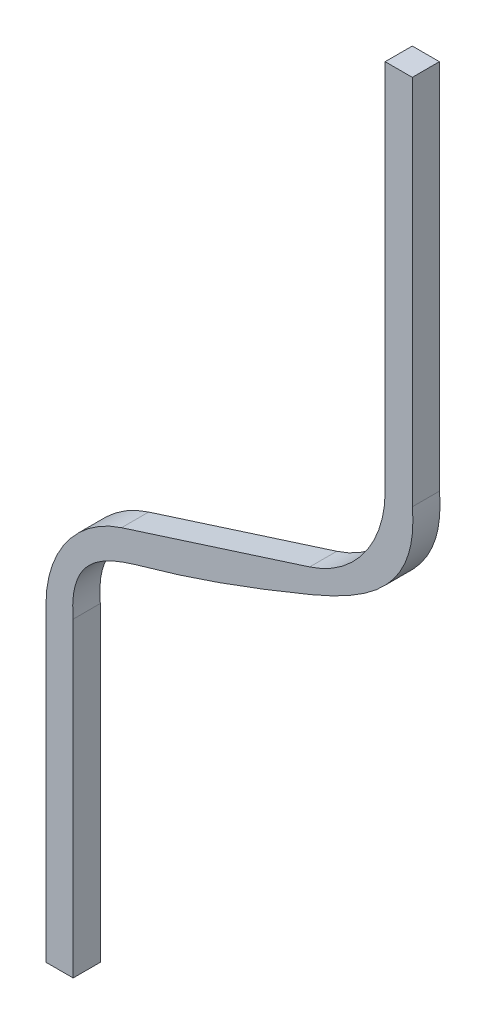
ISO-10303-21;
HEADER;
FILE_DESCRIPTION(('STEP AP214'),'2;1');
FILE_NAME('part.step','',(''),(''),'','','');
FILE_SCHEMA(('AUTOMOTIVE_DESIGN { 1 0 10303 214 1 1 1 1 }'));
ENDSEC;
DATA;
#1=APPLICATION_CONTEXT('core data for automotive mechanical design processes');
#2=APPLICATION_PROTOCOL_DEFINITION('international standard','automotive_design',2000,#1);
#3=PRODUCT_CONTEXT('',#1,'mechanical');
#4=PRODUCT('Part','Part','',(#3));
#5=PRODUCT_RELATED_PRODUCT_CATEGORY('part','',(#4));
#6=PRODUCT_DEFINITION_FORMATION('','',#4);
#7=PRODUCT_DEFINITION_CONTEXT('part definition',#1,'design');
#8=PRODUCT_DEFINITION('design','',#6,#7);
#9=PRODUCT_DEFINITION_SHAPE('','',#8);
#10=(LENGTH_UNIT() NAMED_UNIT(*) SI_UNIT(.MILLI.,.METRE.));
#11=(NAMED_UNIT(*) PLANE_ANGLE_UNIT() SI_UNIT($,.RADIAN.));
#12=(NAMED_UNIT(*) SI_UNIT($,.STERADIAN.) SOLID_ANGLE_UNIT());
#13=UNCERTAINTY_MEASURE_WITH_UNIT(LENGTH_MEASURE(1.E-05),#10,'distance_accuracy_value','');
#14=(GEOMETRIC_REPRESENTATION_CONTEXT(3) GLOBAL_UNCERTAINTY_ASSIGNED_CONTEXT((#13)) GLOBAL_UNIT_ASSIGNED_CONTEXT((#10,
#11,#12)) REPRESENTATION_CONTEXT('',''));
#15=CARTESIAN_POINT('',(0.,0.,0.));
#16=DIRECTION('',(0.,0.,1.));
#17=DIRECTION('',(1.,0.,0.));
#18=AXIS2_PLACEMENT_3D('',#15,#16,#17);
#19=CARTESIAN_POINT('',(0.,0.,0.2));
#20=DIRECTION('',(0.,1.,0.));
#21=DIRECTION('',(0.,0.,1.));
#22=AXIS2_PLACEMENT_3D('',#19,#20,#21);
#23=PLANE('',#22);
#24=DIRECTION('',(1.,0.,0.));
#25=VECTOR('',#24,1.);
#26=CARTESIAN_POINT('',(0.,0.,0.));
#27=LINE('',#26,#25);
#28=CARTESIAN_POINT('',(0.,0.,0.));
#29=VERTEX_POINT('',#28);
#30=CARTESIAN_POINT('',(0.2,0.,0.));
#31=VERTEX_POINT('',#30);
#32=EDGE_CURVE('E142',#29,#31,#27,.T.);
#33=ORIENTED_EDGE('',*,*,#32,.T.);
#34=DIRECTION('',(0.,0.,-1.));
#35=VECTOR('',#34,1.);
#36=CARTESIAN_POINT('',(0.2,0.,0.2));
#37=LINE('',#36,#35);
#38=CARTESIAN_POINT('',(0.2,0.,0.2));
#39=VERTEX_POINT('',#38);
#40=EDGE_CURVE('E11',#39,#31,#37,.T.);
#41=ORIENTED_EDGE('',*,*,#40,.F.);
#42=DIRECTION('',(1.,0.,0.));
#43=VECTOR('',#42,1.);
#44=CARTESIAN_POINT('',(0.,0.,0.2));
#45=LINE('',#44,#43);
#46=CARTESIAN_POINT('',(0.,0.,0.2));
#47=VERTEX_POINT('',#46);
#48=EDGE_CURVE('E165',#47,#39,#45,.T.);
#49=ORIENTED_EDGE('',*,*,#48,.F.);
#50=DIRECTION('',(0.,0.,-1.));
#51=VECTOR('',#50,1.);
#52=CARTESIAN_POINT('',(0.,0.,0.2));
#53=LINE('',#52,#51);
#54=EDGE_CURVE('E138',#47,#29,#53,.T.);
#55=ORIENTED_EDGE('',*,*,#54,.T.);
#56=EDGE_LOOP('',(#33,#41,#49,#55));
#57=FACE_BOUND('',#56,.T.);
#58=ADVANCED_FACE('F34',(#57),#23,.F.);
#59=CARTESIAN_POINT('',(0.2,0.,0.2));
#60=DIRECTION('',(-1.,0.,0.));
#61=DIRECTION('',(0.,0.,1.));
#62=AXIS2_PLACEMENT_3D('',#59,#60,#61);
#63=PLANE('',#62);
#64=DIRECTION('',(0.,1.,0.));
#65=VECTOR('',#64,1.);
#66=CARTESIAN_POINT('',(0.2,0.,0.));
#67=LINE('',#66,#65);
#68=CARTESIAN_POINT('',(0.2,2.29100644298195,0.));
#69=VERTEX_POINT('',#68);
#70=EDGE_CURVE('E145',#31,#69,#67,.T.);
#71=ORIENTED_EDGE('',*,*,#70,.T.);
#72=DIRECTION('',(0.,0.,-1.));
#73=VECTOR('',#72,1.);
#74=CARTESIAN_POINT('',(0.2,2.29100644298195,0.2));
#75=LINE('',#74,#73);
#76=CARTESIAN_POINT('',(0.2,2.29100644298195,0.2));
#77=VERTEX_POINT('',#76);
#78=EDGE_CURVE('E42',#77,#69,#75,.T.);
#79=ORIENTED_EDGE('',*,*,#78,.F.);
#80=DIRECTION('',(0.,1.,0.));
#81=VECTOR('',#80,1.);
#82=CARTESIAN_POINT('',(0.2,0.,0.2));
#83=LINE('',#82,#81);
#84=EDGE_CURVE('E99',#39,#77,#83,.T.);
#85=ORIENTED_EDGE('',*,*,#84,.F.);
#86=ORIENTED_EDGE('',*,*,#40,.T.);
#87=EDGE_LOOP('',(#71,#79,#85,#86));
#88=FACE_BOUND('',#87,.T.);
#89=ADVANCED_FACE('F220',(#88),#63,.F.);
#90=CARTESIAN_POINT('',(0.2,2.29100644298195,0.2));
#91=CARTESIAN_POINT('',(0.158704205299624,2.74640078814028,0.2));
#92=CARTESIAN_POINT('',(0.661928350772557,2.85892474710817,0.2));
#93=CARTESIAN_POINT('',(1.298763247038,3.06508250019146,0.2));
#94=CARTESIAN_POINT('',(2.06606489160483,3.35998366619058,0.2));
#95=CARTESIAN_POINT('',(2.75350088687011,3.66697969407642,0.2));
#96=CARTESIAN_POINT('',(2.7,4.2580472222921,0.2));
#97=B_SPLINE_CURVE_WITH_KNOTS('',3,(#90,#91,#92,#93,#94,#95,#96),.UNSPECIFIED.,.F.,.F.,(4,1,1,1,
4),(0.,0.272332766024393,0.409919087928509,0.591592104356635,1.),.UNSPECIFIED.);
#98=DIRECTION('',(0.,0.,-1.));
#99=VECTOR('',#98,1.);
#100=SURFACE_OF_LINEAR_EXTRUSION('',#97,#99);
#101=CARTESIAN_POINT('',(0.2,2.29100644298195,0.));
#102=CARTESIAN_POINT('',(0.158704205299624,2.74640078814028,0.));
#103=CARTESIAN_POINT('',(0.661928350772557,2.85892474710817,0.));
#104=CARTESIAN_POINT('',(1.298763247038,3.06508250019146,0.));
#105=CARTESIAN_POINT('',(2.06606489160483,3.35998366619058,0.));
#106=CARTESIAN_POINT('',(2.75350088687011,3.66697969407642,0.));
#107=CARTESIAN_POINT('',(2.7,4.2580472222921,0.));
#108=B_SPLINE_CURVE_WITH_KNOTS('',3,(#101,#102,#103,#104,#105,#106,#107),.UNSPECIFIED.,.F.,.F.,
(4,1,1,1,4),(0.,0.272332766024393,0.409919087928509,0.591592104356635,1.),.UNSPECIFIED.);
#109=CARTESIAN_POINT('',(2.7,4.2580472222921,0.));
#110=VERTEX_POINT('',#109);
#111=EDGE_CURVE('E147',#69,#110,#108,.T.);
#112=ORIENTED_EDGE('',*,*,#111,.T.);
#113=DIRECTION('',(0.,0.,-1.));
#114=VECTOR('',#113,1.);
#115=CARTESIAN_POINT('',(2.7,4.2580472222921,0.2));
#116=LINE('',#115,#114);
#117=CARTESIAN_POINT('',(2.7,4.2580472222921,0.2));
#118=VERTEX_POINT('',#117);
#119=EDGE_CURVE('E178',#118,#110,#116,.T.);
#120=ORIENTED_EDGE('',*,*,#119,.F.);
#121=EDGE_CURVE('E186',#77,#118,#97,.T.);
#122=ORIENTED_EDGE('',*,*,#121,.F.);
#123=ORIENTED_EDGE('',*,*,#78,.T.);
#124=EDGE_LOOP('',(#112,#120,#122,#123));
#125=FACE_BOUND('',#124,.T.);
#126=ADVANCED_FACE('F184',(#125),#100,.F.);
#127=CARTESIAN_POINT('',(2.7,7.,0.2));
#128=DIRECTION('',(-1.,0.,0.));
#129=DIRECTION('',(0.,0.,1.));
#130=AXIS2_PLACEMENT_3D('',#127,#128,#129);
#131=PLANE('',#130);
#132=DIRECTION('',(0.,1.,0.));
#133=VECTOR('',#132,1.);
#134=CARTESIAN_POINT('',(2.7,7.,0.));
#135=LINE('',#134,#133);
#136=CARTESIAN_POINT('',(2.7,7.,0.));
#137=VERTEX_POINT('',#136);
#138=EDGE_CURVE('E151',#110,#137,#135,.T.);
#139=ORIENTED_EDGE('',*,*,#138,.T.);
#140=DIRECTION('',(0.,0.,-1.));
#141=VECTOR('',#140,1.);
#142=CARTESIAN_POINT('',(2.7,7.,0.2));
#143=LINE('',#142,#141);
#144=CARTESIAN_POINT('',(2.7,7.,0.2));
#145=VERTEX_POINT('',#144);
#146=EDGE_CURVE('E175',#145,#137,#143,.T.);
#147=ORIENTED_EDGE('',*,*,#146,.F.);
#148=DIRECTION('',(0.,1.,0.));
#149=VECTOR('',#148,1.);
#150=CARTESIAN_POINT('',(2.7,7.,0.2));
#151=LINE('',#150,#149);
#152=EDGE_CURVE('E204',#118,#145,#151,.T.);
#153=ORIENTED_EDGE('',*,*,#152,.F.);
#154=ORIENTED_EDGE('',*,*,#119,.T.);
#155=EDGE_LOOP('',(#139,#147,#153,#154));
#156=FACE_BOUND('',#155,.T.);
#157=ADVANCED_FACE('F195',(#156),#131,.F.);
#158=CARTESIAN_POINT('',(2.5,7.,0.2));
#159=DIRECTION('',(0.,-1.,0.));
#160=DIRECTION('',(0.,0.,-1.));
#161=AXIS2_PLACEMENT_3D('',#158,#159,#160);
#162=PLANE('',#161);
#163=DIRECTION('',(-1.,0.,0.));
#164=VECTOR('',#163,1.);
#165=CARTESIAN_POINT('',(2.5,7.,0.));
#166=LINE('',#165,#164);
#167=CARTESIAN_POINT('',(2.5,7.,0.));
#168=VERTEX_POINT('',#167);
#169=EDGE_CURVE('E156',#137,#168,#166,.T.);
#170=ORIENTED_EDGE('',*,*,#169,.T.);
#171=DIRECTION('',(0.,0.,-1.));
#172=VECTOR('',#171,1.);
#173=CARTESIAN_POINT('',(2.5,7.,0.2));
#174=LINE('',#173,#172);
#175=CARTESIAN_POINT('',(2.5,7.,0.2));
#176=VERTEX_POINT('',#175);
#177=EDGE_CURVE('E172',#176,#168,#174,.T.);
#178=ORIENTED_EDGE('',*,*,#177,.F.);
#179=DIRECTION('',(-1.,0.,0.));
#180=VECTOR('',#179,1.);
#181=CARTESIAN_POINT('',(2.5,7.,0.2));
#182=LINE('',#181,#180);
#183=EDGE_CURVE('E201',#145,#176,#182,.T.);
#184=ORIENTED_EDGE('',*,*,#183,.F.);
#185=ORIENTED_EDGE('',*,*,#146,.T.);
#186=EDGE_LOOP('',(#170,#178,#184,#185));
#187=FACE_BOUND('',#186,.T.);
#188=ADVANCED_FACE('F199',(#187),#162,.F.);
#189=CARTESIAN_POINT('',(2.5,7.,0.2));
#190=DIRECTION('',(1.,0.,0.));
#191=DIRECTION('',(0.,1.,0.));
#192=AXIS2_PLACEMENT_3D('',#189,#190,#191);
#193=PLANE('',#192);
#194=DIRECTION('',(0.,-1.,0.));
#195=VECTOR('',#194,1.);
#196=CARTESIAN_POINT('',(2.5,7.,0.));
#197=LINE('',#196,#195);
#198=CARTESIAN_POINT('',(2.5,4.2580472222921,0.));
#199=VERTEX_POINT('',#198);
#200=EDGE_CURVE('E158',#168,#199,#197,.T.);
#201=ORIENTED_EDGE('',*,*,#200,.T.);
#202=DIRECTION('',(0.,0.,-1.));
#203=VECTOR('',#202,1.);
#204=CARTESIAN_POINT('',(2.5,4.2580472222921,0.2));
#205=LINE('',#204,#203);
#206=CARTESIAN_POINT('',(2.5,4.2580472222921,0.2));
#207=VERTEX_POINT('',#206);
#208=EDGE_CURVE('E169',#207,#199,#205,.T.);
#209=ORIENTED_EDGE('',*,*,#208,.F.);
#210=DIRECTION('',(0.,-1.,0.));
#211=VECTOR('',#210,1.);
#212=CARTESIAN_POINT('',(2.5,7.,0.2));
#213=LINE('',#212,#211);
#214=EDGE_CURVE('E203',#176,#207,#213,.T.);
#215=ORIENTED_EDGE('',*,*,#214,.F.);
#216=ORIENTED_EDGE('',*,*,#177,.T.);
#217=EDGE_LOOP('',(#201,#209,#215,#216));
#218=FACE_BOUND('',#217,.T.);
#219=ADVANCED_FACE('F234',(#218),#193,.F.);
#220=CARTESIAN_POINT('',(1.7,4.2580472222921,0.2));
#221=DIRECTION('',(0.,0.,-1.));
#222=DIRECTION('',(-1.,0.,0.));
#223=AXIS2_PLACEMENT_3D('',#220,#221,#222);
#224=CYLINDRICAL_SURFACE('',#223,0.8);
#225=CARTESIAN_POINT('',(1.7,4.2580472222921,0.));
#226=DIRECTION('',(0.,0.,-1.));
#227=DIRECTION('',(1.,0.,0.));
#228=AXIS2_PLACEMENT_3D('',#225,#226,#227);
#229=CIRCLE('',#228,0.8);
#230=CARTESIAN_POINT('',(1.94338049647134,3.49596721734684,0.));
#231=VERTEX_POINT('',#230);
#232=EDGE_CURVE('E160',#199,#231,#229,.T.);
#233=ORIENTED_EDGE('',*,*,#232,.T.);
#234=DIRECTION('',(0.,0.,-1.));
#235=VECTOR('',#234,1.);
#236=CARTESIAN_POINT('',(1.94338049647134,3.49596721734684,0.2));
#237=LINE('',#236,#235);
#238=CARTESIAN_POINT('',(1.94338049647134,3.49596721734684,0.2));
#239=VERTEX_POINT('',#238);
#240=EDGE_CURVE('E133',#239,#231,#237,.T.);
#241=ORIENTED_EDGE('',*,*,#240,.F.);
#242=CARTESIAN_POINT('',(1.7,4.2580472222921,0.2));
#243=DIRECTION('',(0.,0.,-1.));
#244=DIRECTION('',(1.,0.,0.));
#245=AXIS2_PLACEMENT_3D('',#242,#243,#244);
#246=CIRCLE('',#245,0.8);
#247=EDGE_CURVE('E124',#207,#239,#246,.T.);
#248=ORIENTED_EDGE('',*,*,#247,.F.);
#249=ORIENTED_EDGE('',*,*,#208,.T.);
#250=EDGE_LOOP('',(#233,#241,#248,#249));
#251=FACE_BOUND('',#250,.T.);
#252=ADVANCED_FACE('F231',(#251),#224,.F.);
#253=CARTESIAN_POINT('',(1.94338049647134,3.49596721734684,0.2));
#254=DIRECTION('',(0.304225620589177,-0.952600006181571,0.));
#255=DIRECTION('',(0.952600006181571,0.304225620589177,0.));
#256=AXIS2_PLACEMENT_3D('',#253,#254,#255);
#257=PLANE('',#256);
#258=DIRECTION('',(-0.952600006181571,-0.304225620589177,0.));
#259=VECTOR('',#258,1.);
#260=CARTESIAN_POINT('',(1.94338049647134,3.49596721734684,0.));
#261=LINE('',#260,#259);
#262=CARTESIAN_POINT('',(0.556619503528663,3.0530864479272,0.));
#263=VERTEX_POINT('',#262);
#264=EDGE_CURVE('E132',#231,#263,#261,.T.);
#265=ORIENTED_EDGE('',*,*,#264,.T.);
#266=DIRECTION('',(0.,0.,-1.));
#267=VECTOR('',#266,1.);
#268=CARTESIAN_POINT('',(0.556619503528663,3.0530864479272,0.2));
#269=LINE('',#268,#267);
#270=CARTESIAN_POINT('',(0.556619503528663,3.0530864479272,0.2));
#271=VERTEX_POINT('',#270);
#272=EDGE_CURVE('E129',#271,#263,#269,.T.);
#273=ORIENTED_EDGE('',*,*,#272,.F.);
#274=DIRECTION('',(-0.952600006181571,-0.304225620589177,0.));
#275=VECTOR('',#274,1.);
#276=CARTESIAN_POINT('',(1.94338049647134,3.49596721734684,0.2));
#277=LINE('',#276,#275);
#278=EDGE_CURVE('E118',#239,#271,#277,.T.);
#279=ORIENTED_EDGE('',*,*,#278,.F.);
#280=ORIENTED_EDGE('',*,*,#240,.T.);
#281=EDGE_LOOP('',(#265,#273,#279,#280));
#282=FACE_BOUND('',#281,.T.);
#283=ADVANCED_FACE('F130',(#282),#257,.F.);
#284=CARTESIAN_POINT('',(0.8,2.29100644298194,0.2));
#285=DIRECTION('',(0.,0.,-1.));
#286=DIRECTION('',(-1.,0.,0.));
#287=AXIS2_PLACEMENT_3D('',#284,#285,#286);
#288=CYLINDRICAL_SURFACE('',#287,0.8);
#289=CARTESIAN_POINT('',(0.8,2.29100644298194,0.));
#290=DIRECTION('',(0.,0.,1.));
#291=DIRECTION('',(-1.,0.,0.));
#292=AXIS2_PLACEMENT_3D('',#289,#290,#291);
#293=CIRCLE('',#292,0.8);
#294=CARTESIAN_POINT('',(0.,2.29100644298194,0.));
#295=VERTEX_POINT('',#294);
#296=EDGE_CURVE('E85',#263,#295,#293,.T.);
#297=ORIENTED_EDGE('',*,*,#296,.T.);
#298=DIRECTION('',(0.,0.,-1.));
#299=VECTOR('',#298,1.);
#300=CARTESIAN_POINT('',(0.,2.29100644298194,0.2));
#301=LINE('',#300,#299);
#302=CARTESIAN_POINT('',(0.,2.29100644298194,0.2));
#303=VERTEX_POINT('',#302);
#304=EDGE_CURVE('E134',#303,#295,#301,.T.);
#305=ORIENTED_EDGE('',*,*,#304,.F.);
#306=CARTESIAN_POINT('',(0.8,2.29100644298194,0.2));
#307=DIRECTION('',(0.,0.,1.));
#308=DIRECTION('',(-1.,0.,0.));
#309=AXIS2_PLACEMENT_3D('',#306,#307,#308);
#310=CIRCLE('',#309,0.8);
#311=EDGE_CURVE('E122',#271,#303,#310,.T.);
#312=ORIENTED_EDGE('',*,*,#311,.F.);
#313=ORIENTED_EDGE('',*,*,#272,.T.);
#314=EDGE_LOOP('',(#297,#305,#312,#313));
#315=FACE_BOUND('',#314,.T.);
#316=ADVANCED_FACE('F136',(#315),#288,.T.);
#317=CARTESIAN_POINT('',(0.,0.,0.2));
#318=DIRECTION('',(1.,0.,0.));
#319=DIRECTION('',(0.,0.,-1.));
#320=AXIS2_PLACEMENT_3D('',#317,#318,#319);
#321=PLANE('',#320);
#322=DIRECTION('',(0.,-1.,0.));
#323=VECTOR('',#322,1.);
#324=CARTESIAN_POINT('',(0.,0.,0.));
#325=LINE('',#324,#323);
#326=EDGE_CURVE('E91',#295,#29,#325,.T.);
#327=ORIENTED_EDGE('',*,*,#326,.T.);
#328=ORIENTED_EDGE('',*,*,#54,.F.);
#329=DIRECTION('',(0.,-1.,0.));
#330=VECTOR('',#329,1.);
#331=CARTESIAN_POINT('',(0.,0.,0.2));
#332=LINE('',#331,#330);
#333=EDGE_CURVE('E50',#303,#47,#332,.T.);
#334=ORIENTED_EDGE('',*,*,#333,.F.);
#335=ORIENTED_EDGE('',*,*,#304,.T.);
#336=EDGE_LOOP('',(#327,#328,#334,#335));
#337=FACE_BOUND('',#336,.T.);
#338=ADVANCED_FACE('F247',(#337),#321,.F.);
#339=CARTESIAN_POINT('',(1.5376995226578,3.15827300960887,0.2));
#340=DIRECTION('',(0.,0.,1.));
#341=DIRECTION('',(1.,0.,0.));
#342=AXIS2_PLACEMENT_3D('',#339,#340,#341);
#343=PLANE('',#342);
#344=ORIENTED_EDGE('',*,*,#48,.T.);
#345=ORIENTED_EDGE('',*,*,#84,.T.);
#346=ORIENTED_EDGE('',*,*,#121,.T.);
#347=ORIENTED_EDGE('',*,*,#152,.T.);
#348=ORIENTED_EDGE('',*,*,#183,.T.);
#349=ORIENTED_EDGE('',*,*,#214,.T.);
#350=ORIENTED_EDGE('',*,*,#247,.T.);
#351=ORIENTED_EDGE('',*,*,#278,.T.);
#352=ORIENTED_EDGE('',*,*,#311,.T.);
#353=ORIENTED_EDGE('',*,*,#333,.T.);
#354=EDGE_LOOP('',(#344,#345,#346,#347,#348,#349,#350,#351,#352,#353));
#355=FACE_BOUND('',#354,.T.);
#356=ADVANCED_FACE('F120',(#355),#343,.T.);
#357=CARTESIAN_POINT('',(1.5376995226578,3.15827300960887,0.));
#358=DIRECTION('',(0.,0.,1.));
#359=DIRECTION('',(1.,0.,0.));
#360=AXIS2_PLACEMENT_3D('',#357,#358,#359);
#361=PLANE('',#360);
#362=ORIENTED_EDGE('',*,*,#32,.F.);
#363=ORIENTED_EDGE('',*,*,#326,.F.);
#364=ORIENTED_EDGE('',*,*,#296,.F.);
#365=ORIENTED_EDGE('',*,*,#264,.F.);
#366=ORIENTED_EDGE('',*,*,#232,.F.);
#367=ORIENTED_EDGE('',*,*,#200,.F.);
#368=ORIENTED_EDGE('',*,*,#169,.F.);
#369=ORIENTED_EDGE('',*,*,#138,.F.);
#370=ORIENTED_EDGE('',*,*,#111,.F.);
#371=ORIENTED_EDGE('',*,*,#70,.F.);
#372=EDGE_LOOP('',(#362,#363,#364,#365,#366,#367,#368,#369,#370,#371));
#373=FACE_BOUND('',#372,.T.);
#374=ADVANCED_FACE('F190',(#373),#361,.F.);
#375=CLOSED_SHELL('',(#58,#89,#126,#157,#188,#219,#252,#283,#316,#338,#356,#374));
#376=MANIFOLD_SOLID_BREP('B2',#375);
#377=ADVANCED_BREP_SHAPE_REPRESENTATION('',(#18,#376),#14);
#378=SHAPE_DEFINITION_REPRESENTATION(#9,#377);
ENDSEC;
END-ISO-10303-21;
